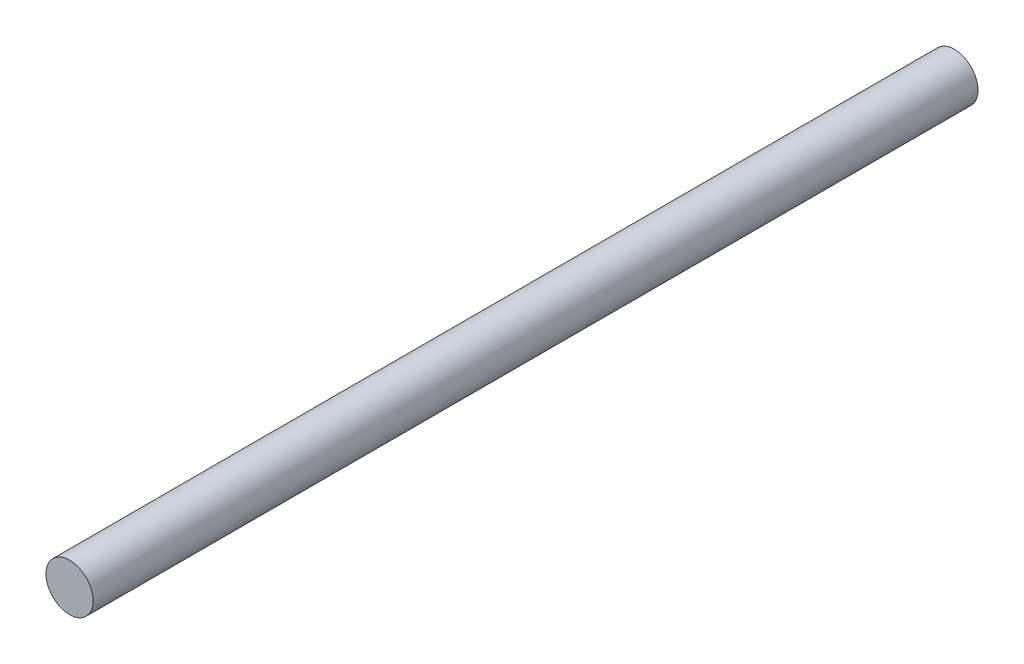
ISO-10303-21;
HEADER;
FILE_DESCRIPTION(('STEP AP214'),'2;1');
FILE_NAME('part.step','',(''),(''),'','','');
FILE_SCHEMA(('AUTOMOTIVE_DESIGN { 1 0 10303 214 1 1 1 1 }'));
ENDSEC;
DATA;
#1=APPLICATION_CONTEXT('core data for automotive mechanical design processes');
#2=APPLICATION_PROTOCOL_DEFINITION('international standard','automotive_design',2000,#1);
#3=PRODUCT_CONTEXT('',#1,'mechanical');
#4=PRODUCT('Part','Part','',(#3));
#5=PRODUCT_RELATED_PRODUCT_CATEGORY('part','',(#4));
#6=PRODUCT_DEFINITION_FORMATION('','',#4);
#7=PRODUCT_DEFINITION_CONTEXT('part definition',#1,'design');
#8=PRODUCT_DEFINITION('design','',#6,#7);
#9=PRODUCT_DEFINITION_SHAPE('','',#8);
#10=(LENGTH_UNIT() NAMED_UNIT(*) SI_UNIT(.MILLI.,.METRE.));
#11=(NAMED_UNIT(*) PLANE_ANGLE_UNIT() SI_UNIT($,.RADIAN.));
#12=(NAMED_UNIT(*) SI_UNIT($,.STERADIAN.) SOLID_ANGLE_UNIT());
#13=UNCERTAINTY_MEASURE_WITH_UNIT(LENGTH_MEASURE(1.E-05),#10,'distance_accuracy_value','');
#14=(GEOMETRIC_REPRESENTATION_CONTEXT(3) GLOBAL_UNCERTAINTY_ASSIGNED_CONTEXT((#13)) GLOBAL_UNIT_ASSIGNED_CONTEXT((#10,
#11,#12)) REPRESENTATION_CONTEXT('',''));
#15=CARTESIAN_POINT('',(0.,0.,0.));
#16=DIRECTION('',(0.,0.,1.));
#17=DIRECTION('',(1.,0.,0.));
#18=AXIS2_PLACEMENT_3D('',#15,#16,#17);
#19=CARTESIAN_POINT('',(0.,0.,300.));
#20=DIRECTION('',(0.,0.,-1.));
#21=DIRECTION('',(-1.,0.,0.));
#22=AXIS2_PLACEMENT_3D('',#19,#20,#21);
#23=CYLINDRICAL_SURFACE('',#22,8.);
#24=CARTESIAN_POINT('',(0.,0.,300.));
#25=DIRECTION('',(0.,0.,1.));
#26=DIRECTION('',(1.,0.,0.));
#27=AXIS2_PLACEMENT_3D('',#24,#25,#26);
#28=CIRCLE('',#27,8.);
#29=CARTESIAN_POINT('',(8.,0.,300.));
#30=VERTEX_POINT('',#29);
#31=EDGE_CURVE('E10',#30,#30,#28,.T.);
#32=ORIENTED_EDGE('',*,*,#31,.F.);
#33=EDGE_LOOP('',(#32));
#34=FACE_BOUND('',#33,.T.);
#35=CARTESIAN_POINT('',(0.,0.,0.));
#36=DIRECTION('',(0.,0.,1.));
#37=DIRECTION('',(1.,0.,0.));
#38=AXIS2_PLACEMENT_3D('',#35,#36,#37);
#39=CIRCLE('',#38,8.);
#40=CARTESIAN_POINT('',(8.,0.,0.));
#41=VERTEX_POINT('',#40);
#42=EDGE_CURVE('E44',#41,#41,#39,.T.);
#43=ORIENTED_EDGE('',*,*,#42,.T.);
#44=EDGE_LOOP('',(#43));
#45=FACE_BOUND('',#44,.T.);
#46=ADVANCED_FACE('F41',(#34,#45),#23,.T.);
#47=CARTESIAN_POINT('',(0.,0.,300.));
#48=DIRECTION('',(0.,0.,1.));
#49=DIRECTION('',(1.,0.,0.));
#50=AXIS2_PLACEMENT_3D('',#47,#48,#49);
#51=PLANE('',#50);
#52=ORIENTED_EDGE('',*,*,#31,.T.);
#53=EDGE_LOOP('',(#52));
#54=FACE_BOUND('',#53,.T.);
#55=ADVANCED_FACE('F58',(#54),#51,.T.);
#56=CARTESIAN_POINT('',(0.,0.,0.));
#57=DIRECTION('',(0.,0.,1.));
#58=DIRECTION('',(1.,0.,0.));
#59=AXIS2_PLACEMENT_3D('',#56,#57,#58);
#60=PLANE('',#59);
#61=ORIENTED_EDGE('',*,*,#42,.F.);
#62=EDGE_LOOP('',(#61));
#63=FACE_BOUND('',#62,.T.);
#64=ADVANCED_FACE('F56',(#63),#60,.F.);
#65=CLOSED_SHELL('',(#46,#55,#64));
#66=MANIFOLD_SOLID_BREP('B2',#65);
#67=ADVANCED_BREP_SHAPE_REPRESENTATION('',(#18,#66),#14);
#68=SHAPE_DEFINITION_REPRESENTATION(#9,#67);
ENDSEC;
END-ISO-10303-21;
